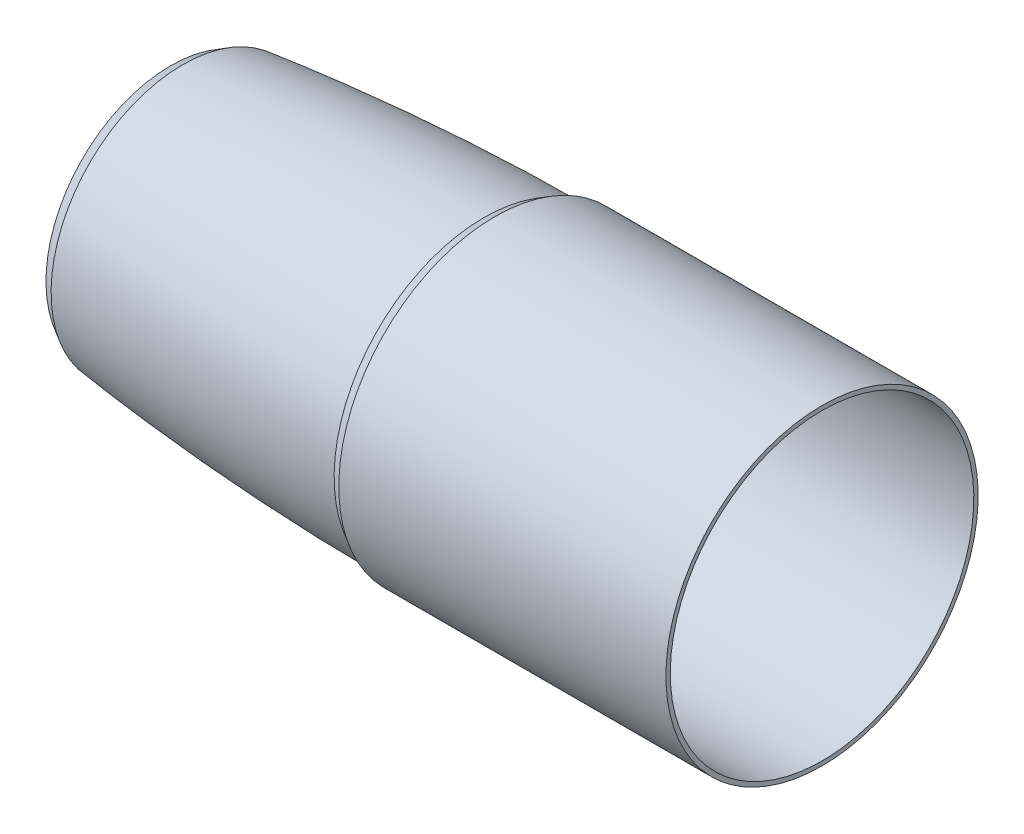
ISO-10303-21;
HEADER;
FILE_DESCRIPTION(('STEP AP214'),'2;1');
FILE_NAME('part.step','',(''),(''),'','','');
FILE_SCHEMA(('AUTOMOTIVE_DESIGN { 1 0 10303 214 1 1 1 1 }'));
ENDSEC;
DATA;
#1=APPLICATION_CONTEXT('core data for automotive mechanical design processes');
#2=APPLICATION_PROTOCOL_DEFINITION('international standard','automotive_design',2000,#1);
#3=PRODUCT_CONTEXT('',#1,'mechanical');
#4=PRODUCT('Part','Part','',(#3));
#5=PRODUCT_RELATED_PRODUCT_CATEGORY('part','',(#4));
#6=PRODUCT_DEFINITION_FORMATION('','',#4);
#7=PRODUCT_DEFINITION_CONTEXT('part definition',#1,'design');
#8=PRODUCT_DEFINITION('design','',#6,#7);
#9=PRODUCT_DEFINITION_SHAPE('','',#8);
#10=(LENGTH_UNIT() NAMED_UNIT(*) SI_UNIT(.MILLI.,.METRE.));
#11=(NAMED_UNIT(*) PLANE_ANGLE_UNIT() SI_UNIT($,.RADIAN.));
#12=(NAMED_UNIT(*) SI_UNIT($,.STERADIAN.) SOLID_ANGLE_UNIT());
#13=UNCERTAINTY_MEASURE_WITH_UNIT(LENGTH_MEASURE(1.E-05),#10,'distance_accuracy_value','');
#14=(GEOMETRIC_REPRESENTATION_CONTEXT(3) GLOBAL_UNCERTAINTY_ASSIGNED_CONTEXT((#13)) GLOBAL_UNIT_ASSIGNED_CONTEXT((#10,
#11,#12)) REPRESENTATION_CONTEXT('',''));
#15=CARTESIAN_POINT('',(0.,0.,0.));
#16=DIRECTION('',(0.,0.,1.));
#17=DIRECTION('',(1.,0.,0.));
#18=AXIS2_PLACEMENT_3D('',#15,#16,#17);
#19=CARTESIAN_POINT('',(0.,0.,0.));
#20=DIRECTION('',(1.,0.,0.));
#21=DIRECTION('',(0.,1.,0.));
#22=AXIS2_PLACEMENT_3D('',#19,#20,#21);
#23=DEGENERATE_TOROIDAL_SURFACE('',#22,642.33383838384,680.33383838384,.F.);
#24=CARTESIAN_POINT('',(-2.78112711575384,0.,0.));
#25=DIRECTION('',(1.,0.,0.));
#26=DIRECTION('',(0.,1.,0.));
#27=AXIS2_PLACEMENT_3D('',#24,#25,#26);
#28=CIRCLE('',#27,37.9943155110688);
#29=CARTESIAN_POINT('',(-2.78112711575385,37.9943155110688,0.));
#30=VERTEX_POINT('',#29);
#31=EDGE_CURVE('E65',#30,#30,#28,.T.);
#32=ORIENTED_EDGE('',*,*,#31,.F.);
#33=EDGE_LOOP('',(#32));
#34=FACE_BOUND('',#33,.T.);
#35=CARTESIAN_POINT('',(-79.2,0.,0.));
#36=DIRECTION('',(1.,0.,0.));
#37=DIRECTION('',(0.,1.,0.));
#38=AXIS2_PLACEMENT_3D('',#35,#36,#37);
#39=CIRCLE('',#38,33.3743024951114);
#40=CARTESIAN_POINT('',(-79.2,33.3743024951114,0.));
#41=VERTEX_POINT('',#40);
#42=EDGE_CURVE('E10',#41,#41,#39,.T.);
#43=ORIENTED_EDGE('',*,*,#42,.T.);
#44=EDGE_LOOP('',(#43));
#45=FACE_BOUND('',#44,.T.);
#46=ADVANCED_FACE('F37',(#34,#45),#23,.F.);
#47=CARTESIAN_POINT('',(-79.2,0.,0.));
#48=DIRECTION('',(1.,0.,0.));
#49=DIRECTION('',(0.,1.,0.));
#50=AXIS2_PLACEMENT_3D('',#47,#48,#49);
#51=CONICAL_SURFACE('',#50,33.3743024951114,0.5235987755983);
#52=CARTESIAN_POINT('',(-82.2805775081931,0.,0.));
#53=DIRECTION('',(1.,0.,0.));
#54=DIRECTION('',(0.,1.,0.));
#55=AXIS2_PLACEMENT_3D('',#52,#53,#54);
#56=CIRCLE('',#55,31.5957302414966);
#57=CARTESIAN_POINT('',(-82.2805775081931,31.5957302414966,0.));
#58=VERTEX_POINT('',#57);
#59=EDGE_CURVE('E43',#58,#58,#56,.T.);
#60=ORIENTED_EDGE('',*,*,#59,.T.);
#61=EDGE_LOOP('',(#60));
#62=FACE_BOUND('',#61,.T.);
#63=ORIENTED_EDGE('',*,*,#42,.F.);
#64=EDGE_LOOP('',(#63));
#65=FACE_BOUND('',#64,.T.);
#66=ADVANCED_FACE('F73',(#62,#65),#51,.T.);
#67=CARTESIAN_POINT('',(0.,0.,0.));
#68=DIRECTION('',(1.,0.,0.));
#69=DIRECTION('',(0.,1.,0.));
#70=AXIS2_PLACEMENT_3D('',#67,#68,#69);
#71=DEGENERATE_TOROIDAL_SURFACE('',#70,642.33383838384,678.93383838384,.F.);
#72=CARTESIAN_POINT('',(0.,0.,0.));
#73=DIRECTION('',(1.,0.,0.));
#74=DIRECTION('',(0.,1.,0.));
#75=AXIS2_PLACEMENT_3D('',#72,#73,#74);
#76=CIRCLE('',#75,36.6);
#77=CARTESIAN_POINT('',(0.,36.6,0.));
#78=VERTEX_POINT('',#77);
#79=EDGE_CURVE('E47',#78,#78,#76,.T.);
#80=ORIENTED_EDGE('',*,*,#79,.T.);
#81=EDGE_LOOP('',(#80));
#82=FACE_BOUND('',#81,.T.);
#83=ORIENTED_EDGE('',*,*,#59,.F.);
#84=EDGE_LOOP('',(#83));
#85=FACE_BOUND('',#84,.T.);
#86=ADVANCED_FACE('F77',(#82,#85),#71,.T.);
#87=CARTESIAN_POINT('',(0.,0.,0.));
#88=DIRECTION('',(1.,0.,0.));
#89=DIRECTION('',(0.,1.,0.));
#90=AXIS2_PLACEMENT_3D('',#87,#88,#89);
#91=CONICAL_SURFACE('',#90,36.6,0.523598775598295);
#92=CARTESIAN_POINT('',(3.29089653438114,0.,0.));
#93=DIRECTION('',(1.,0.,0.));
#94=DIRECTION('',(0.,1.,0.));
#95=AXIS2_PLACEMENT_3D('',#92,#93,#94);
#96=CIRCLE('',#95,38.5000000000001);
#97=CARTESIAN_POINT('',(3.29089653438113,38.5000000000001,0.));
#98=VERTEX_POINT('',#97);
#99=EDGE_CURVE('E51',#98,#98,#96,.T.);
#100=ORIENTED_EDGE('',*,*,#99,.T.);
#101=EDGE_LOOP('',(#100));
#102=FACE_BOUND('',#101,.T.);
#103=ORIENTED_EDGE('',*,*,#79,.F.);
#104=EDGE_LOOP('',(#103));
#105=FACE_BOUND('',#104,.T.);
#106=ADVANCED_FACE('F81',(#102,#105),#91,.F.);
#107=CARTESIAN_POINT('',(0.,0.,0.));
#108=DIRECTION('',(1.,0.,0.));
#109=DIRECTION('',(0.,1.,0.));
#110=AXIS2_PLACEMENT_3D('',#107,#108,#109);
#111=CYLINDRICAL_SURFACE('',#110,38.5000000000001);
#112=ORIENTED_EDGE('',*,*,#99,.F.);
#113=EDGE_LOOP('',(#112));
#114=FACE_BOUND('',#113,.T.);
#115=CARTESIAN_POINT('',(83.,0.,0.));
#116=DIRECTION('',(1.,0.,0.));
#117=DIRECTION('',(0.,1.,0.));
#118=AXIS2_PLACEMENT_3D('',#115,#116,#117);
#119=CIRCLE('',#118,38.5000000000001);
#120=CARTESIAN_POINT('',(83.,38.5000000000001,0.));
#121=VERTEX_POINT('',#120);
#122=EDGE_CURVE('E56',#121,#121,#119,.T.);
#123=ORIENTED_EDGE('',*,*,#122,.T.);
#124=EDGE_LOOP('',(#123));
#125=FACE_BOUND('',#124,.T.);
#126=ADVANCED_FACE('F88',(#114,#125),#111,.F.);
#127=CARTESIAN_POINT('',(83.,0.,0.));
#128=DIRECTION('',(1.,0.,0.));
#129=DIRECTION('',(0.,1.,0.));
#130=AXIS2_PLACEMENT_3D('',#127,#128,#129);
#131=PLANE('',#130);
#132=CARTESIAN_POINT('',(83.,0.,0.));
#133=DIRECTION('',(1.,0.,0.));
#134=DIRECTION('',(0.,1.,0.));
#135=AXIS2_PLACEMENT_3D('',#132,#133,#134);
#136=CIRCLE('',#135,39.6);
#137=CARTESIAN_POINT('',(83.,39.6,0.));
#138=VERTEX_POINT('',#137);
#139=EDGE_CURVE('E59',#138,#138,#136,.T.);
#140=ORIENTED_EDGE('',*,*,#139,.T.);
#141=EDGE_LOOP('',(#140));
#142=FACE_BOUND('',#141,.T.);
#143=ORIENTED_EDGE('',*,*,#122,.F.);
#144=EDGE_LOOP('',(#143));
#145=FACE_BOUND('',#144,.T.);
#146=ADVANCED_FACE('F92',(#142,#145),#131,.T.);
#147=CARTESIAN_POINT('',(0.,0.,0.));
#148=DIRECTION('',(1.,0.,0.));
#149=DIRECTION('',(0.,1.,0.));
#150=AXIS2_PLACEMENT_3D('',#147,#148,#149);
#151=CYLINDRICAL_SURFACE('',#150,39.6);
#152=ORIENTED_EDGE('',*,*,#139,.F.);
#153=EDGE_LOOP('',(#152));
#154=FACE_BOUND('',#153,.T.);
#155=CARTESIAN_POINT('',(0.,0.,0.));
#156=DIRECTION('',(1.,0.,0.));
#157=DIRECTION('',(0.,1.,0.));
#158=AXIS2_PLACEMENT_3D('',#155,#156,#157);
#159=CIRCLE('',#158,39.6);
#160=CARTESIAN_POINT('',(0.,39.6,0.));
#161=VERTEX_POINT('',#160);
#162=EDGE_CURVE('E62',#161,#161,#159,.T.);
#163=ORIENTED_EDGE('',*,*,#162,.T.);
#164=EDGE_LOOP('',(#163));
#165=FACE_BOUND('',#164,.T.);
#166=ADVANCED_FACE('F96',(#154,#165),#151,.T.);
#167=CARTESIAN_POINT('',(0.,0.,0.));
#168=DIRECTION('',(1.,0.,0.));
#169=DIRECTION('',(0.,1.,0.));
#170=AXIS2_PLACEMENT_3D('',#167,#168,#169);
#171=CONICAL_SURFACE('',#170,39.6,0.523598775598346);
#172=ORIENTED_EDGE('',*,*,#31,.T.);
#173=EDGE_LOOP('',(#172));
#174=FACE_BOUND('',#173,.T.);
#175=ORIENTED_EDGE('',*,*,#162,.F.);
#176=EDGE_LOOP('',(#175));
#177=FACE_BOUND('',#176,.T.);
#178=ADVANCED_FACE('F69',(#174,#177),#171,.T.);
#179=CLOSED_SHELL('',(#46,#66,#86,#106,#126,#146,#166,#178));
#180=MANIFOLD_SOLID_BREP('B2',#179);
#181=ADVANCED_BREP_SHAPE_REPRESENTATION('',(#18,#180),#14);
#182=SHAPE_DEFINITION_REPRESENTATION(#9,#181);
ENDSEC;
END-ISO-10303-21;
